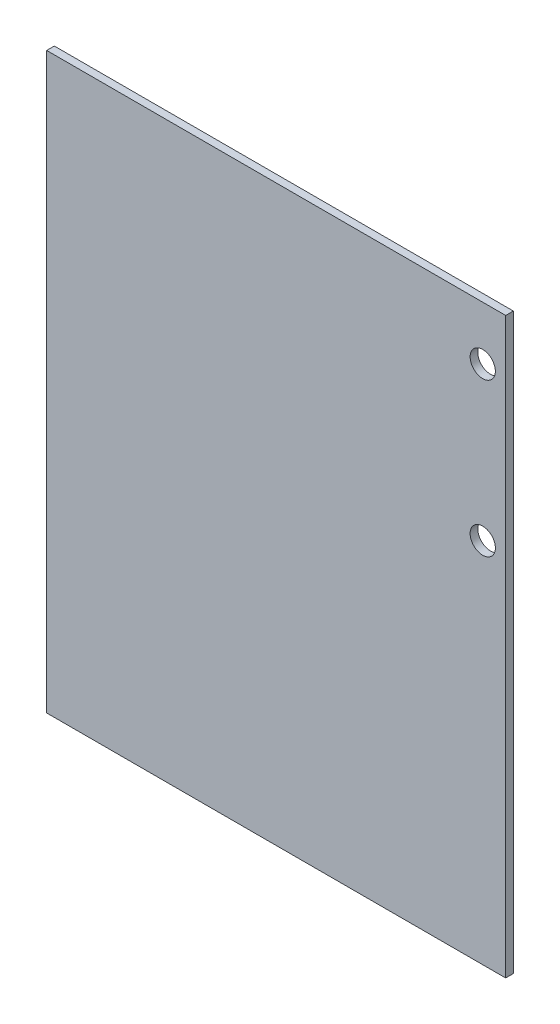
ISO-10303-21;
HEADER;
FILE_DESCRIPTION(('STEP AP214'),'2;1');
FILE_NAME('part.step','',(''),(''),'','','');
FILE_SCHEMA(('AUTOMOTIVE_DESIGN { 1 0 10303 214 1 1 1 1 }'));
ENDSEC;
DATA;
#1=APPLICATION_CONTEXT('core data for automotive mechanical design processes');
#2=APPLICATION_PROTOCOL_DEFINITION('international standard','automotive_design',2000,#1);
#3=PRODUCT_CONTEXT('',#1,'mechanical');
#4=PRODUCT('Part','Part','',(#3));
#5=PRODUCT_RELATED_PRODUCT_CATEGORY('part','',(#4));
#6=PRODUCT_DEFINITION_FORMATION('','',#4);
#7=PRODUCT_DEFINITION_CONTEXT('part definition',#1,'design');
#8=PRODUCT_DEFINITION('design','',#6,#7);
#9=PRODUCT_DEFINITION_SHAPE('','',#8);
#10=(LENGTH_UNIT() NAMED_UNIT(*) SI_UNIT(.MILLI.,.METRE.));
#11=(NAMED_UNIT(*) PLANE_ANGLE_UNIT() SI_UNIT($,.RADIAN.));
#12=(NAMED_UNIT(*) SI_UNIT($,.STERADIAN.) SOLID_ANGLE_UNIT());
#13=UNCERTAINTY_MEASURE_WITH_UNIT(LENGTH_MEASURE(1.E-05),#10,'distance_accuracy_value','');
#14=(GEOMETRIC_REPRESENTATION_CONTEXT(3) GLOBAL_UNCERTAINTY_ASSIGNED_CONTEXT((#13)) GLOBAL_UNIT_ASSIGNED_CONTEXT((#10,
#11,#12)) REPRESENTATION_CONTEXT('',''));
#15=CARTESIAN_POINT('',(0.,0.,0.));
#16=DIRECTION('',(0.,0.,1.));
#17=DIRECTION('',(1.,0.,0.));
#18=AXIS2_PLACEMENT_3D('',#15,#16,#17);
#19=CARTESIAN_POINT('',(30.,37.5,1.));
#20=DIRECTION('',(-1.,0.,0.));
#21=DIRECTION('',(0.,-1.,0.));
#22=AXIS2_PLACEMENT_3D('',#19,#20,#21);
#23=PLANE('',#22);
#24=DIRECTION('',(0.,1.,0.));
#25=VECTOR('',#24,1.);
#26=CARTESIAN_POINT('',(30.,37.5,0.));
#27=LINE('',#26,#25);
#28=CARTESIAN_POINT('',(30.,-37.5,0.));
#29=VERTEX_POINT('',#28);
#30=CARTESIAN_POINT('',(30.,37.5,0.));
#31=VERTEX_POINT('',#30);
#32=EDGE_CURVE('E140',#29,#31,#27,.T.);
#33=ORIENTED_EDGE('',*,*,#32,.T.);
#34=DIRECTION('',(0.,0.,-1.));
#35=VECTOR('',#34,1.);
#36=CARTESIAN_POINT('',(30.,37.5,1.));
#37=LINE('',#36,#35);
#38=CARTESIAN_POINT('',(30.,37.5,1.));
#39=VERTEX_POINT('',#38);
#40=EDGE_CURVE('E12',#39,#31,#37,.T.);
#41=ORIENTED_EDGE('',*,*,#40,.F.);
#42=DIRECTION('',(0.,1.,0.));
#43=VECTOR('',#42,1.);
#44=CARTESIAN_POINT('',(30.,37.5,1.));
#45=LINE('',#44,#43);
#46=CARTESIAN_POINT('',(30.,-37.5,1.));
#47=VERTEX_POINT('',#46);
#48=EDGE_CURVE('E98',#47,#39,#45,.T.);
#49=ORIENTED_EDGE('',*,*,#48,.F.);
#50=DIRECTION('',(0.,0.,-1.));
#51=VECTOR('',#50,1.);
#52=CARTESIAN_POINT('',(30.,-37.5,1.));
#53=LINE('',#52,#51);
#54=EDGE_CURVE('E110',#47,#29,#53,.T.);
#55=ORIENTED_EDGE('',*,*,#54,.T.);
#56=EDGE_LOOP('',(#33,#41,#49,#55));
#57=FACE_BOUND('',#56,.T.);
#58=ADVANCED_FACE('F46',(#57),#23,.F.);
#59=CARTESIAN_POINT('',(-30.,37.5,1.));
#60=DIRECTION('',(0.,-1.,0.));
#61=DIRECTION('',(0.,0.,-1.));
#62=AXIS2_PLACEMENT_3D('',#59,#60,#61);
#63=PLANE('',#62);
#64=DIRECTION('',(-1.,0.,0.));
#65=VECTOR('',#64,1.);
#66=CARTESIAN_POINT('',(-30.,37.5,0.));
#67=LINE('',#66,#65);
#68=CARTESIAN_POINT('',(-30.,37.5,0.));
#69=VERTEX_POINT('',#68);
#70=EDGE_CURVE('E103',#31,#69,#67,.T.);
#71=ORIENTED_EDGE('',*,*,#70,.T.);
#72=DIRECTION('',(0.,0.,-1.));
#73=VECTOR('',#72,1.);
#74=CARTESIAN_POINT('',(-30.,37.5,1.));
#75=LINE('',#74,#73);
#76=CARTESIAN_POINT('',(-30.,37.5,1.));
#77=VERTEX_POINT('',#76);
#78=EDGE_CURVE('E55',#77,#69,#75,.T.);
#79=ORIENTED_EDGE('',*,*,#78,.F.);
#80=DIRECTION('',(-1.,0.,0.));
#81=VECTOR('',#80,1.);
#82=CARTESIAN_POINT('',(-30.,37.5,1.));
#83=LINE('',#82,#81);
#84=EDGE_CURVE('E93',#39,#77,#83,.T.);
#85=ORIENTED_EDGE('',*,*,#84,.F.);
#86=ORIENTED_EDGE('',*,*,#40,.T.);
#87=EDGE_LOOP('',(#71,#79,#85,#86));
#88=FACE_BOUND('',#87,.T.);
#89=ADVANCED_FACE('F102',(#88),#63,.F.);
#90=CARTESIAN_POINT('',(-30.,37.5,1.));
#91=DIRECTION('',(1.,0.,0.));
#92=DIRECTION('',(0.,1.,0.));
#93=AXIS2_PLACEMENT_3D('',#90,#91,#92);
#94=PLANE('',#93);
#95=DIRECTION('',(0.,-1.,0.));
#96=VECTOR('',#95,1.);
#97=CARTESIAN_POINT('',(-30.,37.5,0.));
#98=LINE('',#97,#96);
#99=CARTESIAN_POINT('',(-30.,-37.5,0.));
#100=VERTEX_POINT('',#99);
#101=EDGE_CURVE('E80',#69,#100,#98,.T.);
#102=ORIENTED_EDGE('',*,*,#101,.T.);
#103=DIRECTION('',(0.,0.,-1.));
#104=VECTOR('',#103,1.);
#105=CARTESIAN_POINT('',(-30.,-37.5,1.));
#106=LINE('',#105,#104);
#107=CARTESIAN_POINT('',(-30.,-37.5,1.));
#108=VERTEX_POINT('',#107);
#109=EDGE_CURVE('E105',#108,#100,#106,.T.);
#110=ORIENTED_EDGE('',*,*,#109,.F.);
#111=DIRECTION('',(0.,-1.,0.));
#112=VECTOR('',#111,1.);
#113=CARTESIAN_POINT('',(-30.,37.5,1.));
#114=LINE('',#113,#112);
#115=EDGE_CURVE('E96',#77,#108,#114,.T.);
#116=ORIENTED_EDGE('',*,*,#115,.F.);
#117=ORIENTED_EDGE('',*,*,#78,.T.);
#118=EDGE_LOOP('',(#102,#110,#116,#117));
#119=FACE_BOUND('',#118,.T.);
#120=ADVANCED_FACE('F106',(#119),#94,.F.);
#121=CARTESIAN_POINT('',(-30.,-37.5,1.));
#122=DIRECTION('',(0.,1.,0.));
#123=DIRECTION('',(0.,0.,1.));
#124=AXIS2_PLACEMENT_3D('',#121,#122,#123);
#125=PLANE('',#124);
#126=DIRECTION('',(1.,0.,0.));
#127=VECTOR('',#126,1.);
#128=CARTESIAN_POINT('',(-30.,-37.5,0.));
#129=LINE('',#128,#127);
#130=EDGE_CURVE('E86',#100,#29,#129,.T.);
#131=ORIENTED_EDGE('',*,*,#130,.T.);
#132=ORIENTED_EDGE('',*,*,#54,.F.);
#133=DIRECTION('',(1.,0.,0.));
#134=VECTOR('',#133,1.);
#135=CARTESIAN_POINT('',(-30.,-37.5,1.));
#136=LINE('',#135,#134);
#137=EDGE_CURVE('E63',#108,#47,#136,.T.);
#138=ORIENTED_EDGE('',*,*,#137,.F.);
#139=ORIENTED_EDGE('',*,*,#109,.T.);
#140=EDGE_LOOP('',(#131,#132,#138,#139));
#141=FACE_BOUND('',#140,.T.);
#142=ADVANCED_FACE('F157',(#141),#125,.F.);
#143=CARTESIAN_POINT('',(0.,0.,1.));
#144=DIRECTION('',(0.,0.,1.));
#145=DIRECTION('',(1.,0.,0.));
#146=AXIS2_PLACEMENT_3D('',#143,#144,#145);
#147=PLANE('',#146);
#148=CARTESIAN_POINT('',(27.,30.5,1.));
#149=DIRECTION('',(0.,0.,1.));
#150=DIRECTION('',(1.,0.,0.));
#151=AXIS2_PLACEMENT_3D('',#148,#149,#150);
#152=CIRCLE('',#151,1.65);
#153=CARTESIAN_POINT('',(28.65,30.5,1.));
#154=VERTEX_POINT('',#153);
#155=EDGE_CURVE('E132',#154,#154,#152,.T.);
#156=ORIENTED_EDGE('',*,*,#155,.F.);
#157=EDGE_LOOP('',(#156));
#158=FACE_BOUND('',#157,.T.);
#159=CARTESIAN_POINT('',(27.,10.5,1.));
#160=DIRECTION('',(0.,0.,1.));
#161=DIRECTION('',(1.,0.,0.));
#162=AXIS2_PLACEMENT_3D('',#159,#160,#161);
#163=CIRCLE('',#162,1.65);
#164=CARTESIAN_POINT('',(28.65,10.5,1.));
#165=VERTEX_POINT('',#164);
#166=EDGE_CURVE('E127',#165,#165,#163,.T.);
#167=ORIENTED_EDGE('',*,*,#166,.F.);
#168=EDGE_LOOP('',(#167));
#169=FACE_BOUND('',#168,.T.);
#170=ORIENTED_EDGE('',*,*,#48,.T.);
#171=ORIENTED_EDGE('',*,*,#84,.T.);
#172=ORIENTED_EDGE('',*,*,#115,.T.);
#173=ORIENTED_EDGE('',*,*,#137,.T.);
#174=EDGE_LOOP('',(#170,#171,#172,#173));
#175=FACE_BOUND('',#174,.T.);
#176=ADVANCED_FACE('F94',(#158,#169,#175),#147,.T.);
#177=CARTESIAN_POINT('',(0.,0.,0.));
#178=DIRECTION('',(0.,0.,1.));
#179=DIRECTION('',(1.,0.,0.));
#180=AXIS2_PLACEMENT_3D('',#177,#178,#179);
#181=PLANE('',#180);
#182=CARTESIAN_POINT('',(27.,30.5,0.));
#183=DIRECTION('',(0.,0.,1.));
#184=DIRECTION('',(1.,0.,0.));
#185=AXIS2_PLACEMENT_3D('',#182,#183,#184);
#186=CIRCLE('',#185,1.65);
#187=CARTESIAN_POINT('',(28.65,30.5,0.));
#188=VERTEX_POINT('',#187);
#189=EDGE_CURVE('E137',#188,#188,#186,.T.);
#190=ORIENTED_EDGE('',*,*,#189,.T.);
#191=EDGE_LOOP('',(#190));
#192=FACE_BOUND('',#191,.T.);
#193=CARTESIAN_POINT('',(27.,10.5,0.));
#194=DIRECTION('',(0.,0.,1.));
#195=DIRECTION('',(1.,0.,0.));
#196=AXIS2_PLACEMENT_3D('',#193,#194,#195);
#197=CIRCLE('',#196,1.65);
#198=CARTESIAN_POINT('',(28.65,10.5,0.));
#199=VERTEX_POINT('',#198);
#200=EDGE_CURVE('E124',#199,#199,#197,.T.);
#201=ORIENTED_EDGE('',*,*,#200,.T.);
#202=EDGE_LOOP('',(#201));
#203=FACE_BOUND('',#202,.T.);
#204=ORIENTED_EDGE('',*,*,#32,.F.);
#205=ORIENTED_EDGE('',*,*,#130,.F.);
#206=ORIENTED_EDGE('',*,*,#101,.F.);
#207=ORIENTED_EDGE('',*,*,#70,.F.);
#208=EDGE_LOOP('',(#204,#205,#206,#207));
#209=FACE_BOUND('',#208,.T.);
#210=ADVANCED_FACE('F159',(#192,#203,#209),#181,.F.);
#211=CARTESIAN_POINT('',(27.,10.5,0.));
#212=DIRECTION('',(0.,0.,1.));
#213=DIRECTION('',(1.,0.,0.));
#214=AXIS2_PLACEMENT_3D('',#211,#212,#213);
#215=CYLINDRICAL_SURFACE('',#214,1.65);
#216=ORIENTED_EDGE('',*,*,#200,.F.);
#217=EDGE_LOOP('',(#216));
#218=FACE_BOUND('',#217,.T.);
#219=ORIENTED_EDGE('',*,*,#166,.T.);
#220=EDGE_LOOP('',(#219));
#221=FACE_BOUND('',#220,.T.);
#222=ADVANCED_FACE('F173',(#218,#221),#215,.F.);
#223=CARTESIAN_POINT('',(27.,30.5,0.));
#224=DIRECTION('',(0.,0.,1.));
#225=DIRECTION('',(1.,0.,0.));
#226=AXIS2_PLACEMENT_3D('',#223,#224,#225);
#227=CYLINDRICAL_SURFACE('',#226,1.65);
#228=ORIENTED_EDGE('',*,*,#189,.F.);
#229=EDGE_LOOP('',(#228));
#230=FACE_BOUND('',#229,.T.);
#231=ORIENTED_EDGE('',*,*,#155,.T.);
#232=EDGE_LOOP('',(#231));
#233=FACE_BOUND('',#232,.T.);
#234=ADVANCED_FACE('F179',(#230,#233),#227,.F.);
#235=CLOSED_SHELL('',(#58,#89,#120,#142,#176,#210,#222,#234));
#236=MANIFOLD_SOLID_BREP('B2',#235);
#237=ADVANCED_BREP_SHAPE_REPRESENTATION('',(#18,#236),#14);
#238=SHAPE_DEFINITION_REPRESENTATION(#9,#237);
ENDSEC;
END-ISO-10303-21;
